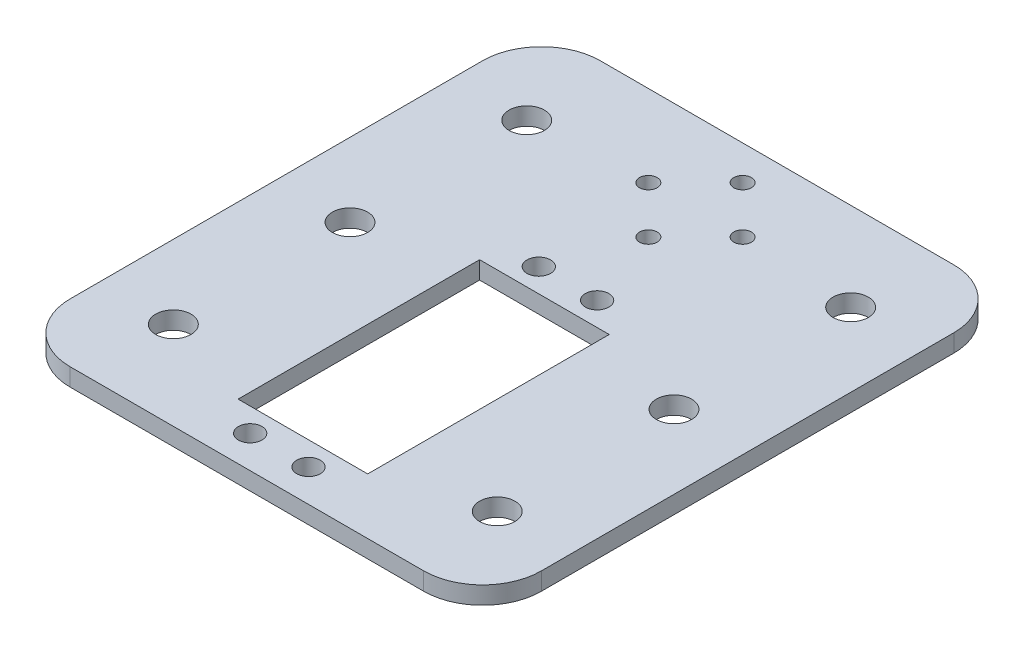
ISO-10303-21;
HEADER;
FILE_DESCRIPTION(('STEP AP214'),'2;1');
FILE_NAME('part.step','',(''),(''),'','','');
FILE_SCHEMA(('AUTOMOTIVE_DESIGN { 1 0 10303 214 1 1 1 1 }'));
ENDSEC;
DATA;
#1=APPLICATION_CONTEXT('core data for automotive mechanical design processes');
#2=APPLICATION_PROTOCOL_DEFINITION('international standard','automotive_design',2000,#1);
#3=PRODUCT_CONTEXT('',#1,'mechanical');
#4=PRODUCT('Part','Part','',(#3));
#5=PRODUCT_RELATED_PRODUCT_CATEGORY('part','',(#4));
#6=PRODUCT_DEFINITION_FORMATION('','',#4);
#7=PRODUCT_DEFINITION_CONTEXT('part definition',#1,'design');
#8=PRODUCT_DEFINITION('design','',#6,#7);
#9=PRODUCT_DEFINITION_SHAPE('','',#8);
#10=(LENGTH_UNIT() NAMED_UNIT(*) SI_UNIT(.MILLI.,.METRE.));
#11=(NAMED_UNIT(*) PLANE_ANGLE_UNIT() SI_UNIT($,.RADIAN.));
#12=(NAMED_UNIT(*) SI_UNIT($,.STERADIAN.) SOLID_ANGLE_UNIT());
#13=UNCERTAINTY_MEASURE_WITH_UNIT(LENGTH_MEASURE(1.E-05),#10,'distance_accuracy_value','');
#14=(GEOMETRIC_REPRESENTATION_CONTEXT(3) GLOBAL_UNCERTAINTY_ASSIGNED_CONTEXT((#13)) GLOBAL_UNIT_ASSIGNED_CONTEXT((#10,
#11,#12)) REPRESENTATION_CONTEXT('',''));
#15=CARTESIAN_POINT('',(0.,0.,0.));
#16=DIRECTION('',(0.,0.,1.));
#17=DIRECTION('',(1.,0.,0.));
#18=AXIS2_PLACEMENT_3D('',#15,#16,#17);
#19=CARTESIAN_POINT('',(0.,3.,0.));
#20=DIRECTION('',(0.,1.,0.));
#21=DIRECTION('',(0.,0.,1.));
#22=AXIS2_PLACEMENT_3D('',#19,#20,#21);
#23=PLANE('',#22);
#24=CARTESIAN_POINT('',(0.,3.,-54.15));
#25=DIRECTION('',(0.,1.,0.));
#26=DIRECTION('',(0.,0.,1.));
#27=AXIS2_PLACEMENT_3D('',#24,#25,#26);
#28=CIRCLE('',#27,1.5);
#29=CARTESIAN_POINT('',(0.,3.,-52.65));
#30=VERTEX_POINT('',#29);
#31=EDGE_CURVE('E615',#30,#30,#28,.T.);
#32=ORIENTED_EDGE('',*,*,#31,.F.);
#33=EDGE_LOOP('',(#32));
#34=FACE_BOUND('',#33,.T.);
#35=CARTESIAN_POINT('',(7.99999999999997,3.,-46.15));
#36=DIRECTION('',(0.,1.,0.));
#37=DIRECTION('',(0.,0.,1.));
#38=AXIS2_PLACEMENT_3D('',#35,#36,#37);
#39=CIRCLE('',#38,1.49999999999995);
#40=CARTESIAN_POINT('',(7.99999999999997,3.,-44.65));
#41=VERTEX_POINT('',#40);
#42=EDGE_CURVE('E642',#41,#41,#39,.T.);
#43=ORIENTED_EDGE('',*,*,#42,.F.);
#44=EDGE_LOOP('',(#43));
#45=FACE_BOUND('',#44,.T.);
#46=CARTESIAN_POINT('',(0.,3.,-38.15));
#47=DIRECTION('',(0.,1.,0.));
#48=DIRECTION('',(0.,0.,1.));
#49=AXIS2_PLACEMENT_3D('',#46,#47,#48);
#50=CIRCLE('',#49,1.49999999999984);
#51=CARTESIAN_POINT('',(0.,3.,-36.6500000000002));
#52=VERTEX_POINT('',#51);
#53=EDGE_CURVE('E636',#52,#52,#50,.T.);
#54=ORIENTED_EDGE('',*,*,#53,.F.);
#55=EDGE_LOOP('',(#54));
#56=FACE_BOUND('',#55,.T.);
#57=CARTESIAN_POINT('',(-8.00000000000004,3.,-46.15));
#58=DIRECTION('',(0.,1.,0.));
#59=DIRECTION('',(0.,0.,1.));
#60=AXIS2_PLACEMENT_3D('',#57,#58,#59);
#61=CIRCLE('',#60,1.49999999999995);
#62=CARTESIAN_POINT('',(-8.00000000000004,3.,-44.6500000000001));
#63=VERTEX_POINT('',#62);
#64=EDGE_CURVE('E630',#63,#63,#61,.T.);
#65=ORIENTED_EDGE('',*,*,#64,.F.);
#66=EDGE_LOOP('',(#65));
#67=FACE_BOUND('',#66,.T.);
#68=CARTESIAN_POINT('',(27.4999999999999,3.,-45.));
#69=DIRECTION('',(0.,1.,0.));
#70=DIRECTION('',(0.,0.,1.));
#71=AXIS2_PLACEMENT_3D('',#68,#69,#70);
#72=CIRCLE('',#71,3.);
#73=CARTESIAN_POINT('',(27.4999999999999,3.,-42.));
#74=VERTEX_POINT('',#73);
#75=EDGE_CURVE('E161',#74,#74,#72,.T.);
#76=ORIENTED_EDGE('',*,*,#75,.F.);
#77=EDGE_LOOP('',(#76));
#78=FACE_BOUND('',#77,.T.);
#79=CARTESIAN_POINT('',(4.95,3.,24.5));
#80=DIRECTION('',(0.,1.,0.));
#81=DIRECTION('',(0.,0.,-1.));
#82=AXIS2_PLACEMENT_3D('',#79,#80,#81);
#83=CIRCLE('',#82,2.);
#84=CARTESIAN_POINT('',(4.95,3.,22.5));
#85=VERTEX_POINT('',#84);
#86=EDGE_CURVE('E178',#85,#85,#83,.T.);
#87=ORIENTED_EDGE('',*,*,#86,.F.);
#88=EDGE_LOOP('',(#87));
#89=FACE_BOUND('',#88,.T.);
#90=CARTESIAN_POINT('',(4.95,3.,-24.5));
#91=DIRECTION('',(0.,1.,0.));
#92=DIRECTION('',(0.,0.,1.));
#93=AXIS2_PLACEMENT_3D('',#90,#91,#92);
#94=CIRCLE('',#93,2.);
#95=CARTESIAN_POINT('',(4.95,3.,-22.5));
#96=VERTEX_POINT('',#95);
#97=EDGE_CURVE('E190',#96,#96,#94,.T.);
#98=ORIENTED_EDGE('',*,*,#97,.F.);
#99=EDGE_LOOP('',(#98));
#100=FACE_BOUND('',#99,.T.);
#101=CARTESIAN_POINT('',(-27.5,3.,15.));
#102=DIRECTION('',(0.,1.,0.));
#103=DIRECTION('',(0.,0.,-1.));
#104=AXIS2_PLACEMENT_3D('',#101,#102,#103);
#105=CIRCLE('',#104,3.);
#106=CARTESIAN_POINT('',(-27.5,3.,12.));
#107=VERTEX_POINT('',#106);
#108=EDGE_CURVE('E202',#107,#107,#105,.T.);
#109=ORIENTED_EDGE('',*,*,#108,.F.);
#110=EDGE_LOOP('',(#109));
#111=FACE_BOUND('',#110,.T.);
#112=CARTESIAN_POINT('',(27.5,3.,-15.));
#113=DIRECTION('',(0.,1.,0.));
#114=DIRECTION('',(0.,0.,1.));
#115=AXIS2_PLACEMENT_3D('',#112,#113,#114);
#116=CIRCLE('',#115,3.);
#117=CARTESIAN_POINT('',(27.5,3.,-12.));
#118=VERTEX_POINT('',#117);
#119=EDGE_CURVE('E214',#118,#118,#116,.T.);
#120=ORIENTED_EDGE('',*,*,#119,.F.);
#121=EDGE_LOOP('',(#120));
#122=FACE_BOUND('',#121,.T.);
#123=DIRECTION('',(-1.,0.,0.));
#124=VECTOR('',#123,1.);
#125=CARTESIAN_POINT('',(-40.,3.,-60.));
#126=LINE('',#125,#124);
#127=CARTESIAN_POINT('',(30.,3.,-60.));
#128=VERTEX_POINT('',#127);
#129=CARTESIAN_POINT('',(-30.,3.,-60.));
#130=VERTEX_POINT('',#129);
#131=EDGE_CURVE('E220',#128,#130,#126,.T.);
#132=ORIENTED_EDGE('',*,*,#131,.T.);
#133=CARTESIAN_POINT('',(-30.,3.,-50.));
#134=DIRECTION('',(0.,1.,0.));
#135=DIRECTION('',(0.,0.,1.));
#136=AXIS2_PLACEMENT_3D('',#133,#134,#135);
#137=CIRCLE('',#136,10.);
#138=CARTESIAN_POINT('',(-40.,3.,-50.));
#139=VERTEX_POINT('',#138);
#140=EDGE_CURVE('E263',#130,#139,#137,.T.);
#141=ORIENTED_EDGE('',*,*,#140,.T.);
#142=DIRECTION('',(0.,0.,1.));
#143=VECTOR('',#142,1.);
#144=CARTESIAN_POINT('',(-40.,3.,30.));
#145=LINE('',#144,#143);
#146=CARTESIAN_POINT('',(-40.,3.,20.));
#147=VERTEX_POINT('',#146);
#148=EDGE_CURVE('E223',#139,#147,#145,.T.);
#149=ORIENTED_EDGE('',*,*,#148,.T.);
#150=CARTESIAN_POINT('',(-30.,3.,20.));
#151=DIRECTION('',(0.,1.,0.));
#152=DIRECTION('',(0.,0.,1.));
#153=AXIS2_PLACEMENT_3D('',#150,#151,#152);
#154=CIRCLE('',#153,10.);
#155=CARTESIAN_POINT('',(-30.,3.,30.));
#156=VERTEX_POINT('',#155);
#157=EDGE_CURVE('E258',#147,#156,#154,.T.);
#158=ORIENTED_EDGE('',*,*,#157,.T.);
#159=DIRECTION('',(1.,0.,0.));
#160=VECTOR('',#159,1.);
#161=CARTESIAN_POINT('',(-40.,3.,30.));
#162=LINE('',#161,#160);
#163=CARTESIAN_POINT('',(30.,3.,30.));
#164=VERTEX_POINT('',#163);
#165=EDGE_CURVE('E227',#156,#164,#162,.T.);
#166=ORIENTED_EDGE('',*,*,#165,.T.);
#167=CARTESIAN_POINT('',(30.,3.,20.));
#168=DIRECTION('',(0.,1.,0.));
#169=DIRECTION('',(0.,0.,1.));
#170=AXIS2_PLACEMENT_3D('',#167,#168,#169);
#171=CIRCLE('',#170,10.);
#172=CARTESIAN_POINT('',(40.,3.,20.));
#173=VERTEX_POINT('',#172);
#174=EDGE_CURVE('E59',#164,#173,#171,.T.);
#175=ORIENTED_EDGE('',*,*,#174,.T.);
#176=DIRECTION('',(0.,0.,-1.));
#177=VECTOR('',#176,1.);
#178=CARTESIAN_POINT('',(40.,3.,30.));
#179=LINE('',#178,#177);
#180=CARTESIAN_POINT('',(40.,3.,-50.));
#181=VERTEX_POINT('',#180);
#182=EDGE_CURVE('E229',#173,#181,#179,.T.);
#183=ORIENTED_EDGE('',*,*,#182,.T.);
#184=CARTESIAN_POINT('',(30.,3.,-50.));
#185=DIRECTION('',(0.,1.,0.));
#186=DIRECTION('',(0.,0.,1.));
#187=AXIS2_PLACEMENT_3D('',#184,#185,#186);
#188=CIRCLE('',#187,10.);
#189=EDGE_CURVE('E261',#181,#128,#188,.T.);
#190=ORIENTED_EDGE('',*,*,#189,.T.);
#191=EDGE_LOOP('',(#132,#141,#149,#158,#166,#175,#183,#190));
#192=FACE_BOUND('',#191,.T.);
#193=CARTESIAN_POINT('',(27.5,3.,15.));
#194=DIRECTION('',(0.,1.,0.));
#195=DIRECTION('',(0.,0.,1.));
#196=AXIS2_PLACEMENT_3D('',#193,#194,#195);
#197=CIRCLE('',#196,3.);
#198=CARTESIAN_POINT('',(27.5,3.,18.));
#199=VERTEX_POINT('',#198);
#200=EDGE_CURVE('E208',#199,#199,#197,.T.);
#201=ORIENTED_EDGE('',*,*,#200,.F.);
#202=EDGE_LOOP('',(#201));
#203=FACE_BOUND('',#202,.T.);
#204=CARTESIAN_POINT('',(-27.5,3.,-15.));
#205=DIRECTION('',(0.,1.,0.));
#206=DIRECTION('',(0.,0.,-1.));
#207=AXIS2_PLACEMENT_3D('',#204,#205,#206);
#208=CIRCLE('',#207,3.);
#209=CARTESIAN_POINT('',(-27.5,3.,-18.));
#210=VERTEX_POINT('',#209);
#211=EDGE_CURVE('E196',#210,#210,#208,.T.);
#212=ORIENTED_EDGE('',*,*,#211,.F.);
#213=EDGE_LOOP('',(#212));
#214=FACE_BOUND('',#213,.T.);
#215=CARTESIAN_POINT('',(-4.95,3.,-24.5));
#216=DIRECTION('',(0.,1.,0.));
#217=DIRECTION('',(0.,0.,-1.));
#218=AXIS2_PLACEMENT_3D('',#215,#216,#217);
#219=CIRCLE('',#218,2.);
#220=CARTESIAN_POINT('',(-4.95,3.,-26.5));
#221=VERTEX_POINT('',#220);
#222=EDGE_CURVE('E184',#221,#221,#219,.T.);
#223=ORIENTED_EDGE('',*,*,#222,.F.);
#224=EDGE_LOOP('',(#223));
#225=FACE_BOUND('',#224,.T.);
#226=CARTESIAN_POINT('',(-4.95,3.,24.5));
#227=DIRECTION('',(0.,1.,0.));
#228=DIRECTION('',(0.,0.,1.));
#229=AXIS2_PLACEMENT_3D('',#226,#227,#228);
#230=CIRCLE('',#229,2.);
#231=CARTESIAN_POINT('',(-4.95,3.,26.5));
#232=VERTEX_POINT('',#231);
#233=EDGE_CURVE('E172',#232,#232,#230,.T.);
#234=ORIENTED_EDGE('',*,*,#233,.F.);
#235=EDGE_LOOP('',(#234));
#236=FACE_BOUND('',#235,.T.);
#237=DIRECTION('',(-1.,0.,0.));
#238=VECTOR('',#237,1.);
#239=CARTESIAN_POINT('',(-11.,3.,-20.5));
#240=LINE('',#239,#238);
#241=CARTESIAN_POINT('',(11.,3.,-20.5));
#242=VERTEX_POINT('',#241);
#243=CARTESIAN_POINT('',(-11.,3.,-20.5));
#244=VERTEX_POINT('',#243);
#245=EDGE_CURVE('E138',#242,#244,#240,.T.);
#246=ORIENTED_EDGE('',*,*,#245,.F.);
#247=DIRECTION('',(0.,0.,-1.));
#248=VECTOR('',#247,1.);
#249=CARTESIAN_POINT('',(11.,3.,20.5));
#250=LINE('',#249,#248);
#251=CARTESIAN_POINT('',(11.,3.,20.5));
#252=VERTEX_POINT('',#251);
#253=EDGE_CURVE('E128',#252,#242,#250,.T.);
#254=ORIENTED_EDGE('',*,*,#253,.F.);
#255=DIRECTION('',(1.,0.,0.));
#256=VECTOR('',#255,1.);
#257=CARTESIAN_POINT('',(-11.,3.,20.5));
#258=LINE('',#257,#256);
#259=CARTESIAN_POINT('',(-11.,3.,20.5));
#260=VERTEX_POINT('',#259);
#261=EDGE_CURVE('E154',#260,#252,#258,.T.);
#262=ORIENTED_EDGE('',*,*,#261,.F.);
#263=DIRECTION('',(0.,0.,1.));
#264=VECTOR('',#263,1.);
#265=CARTESIAN_POINT('',(-11.,3.,20.5));
#266=LINE('',#265,#264);
#267=EDGE_CURVE('E152',#244,#260,#266,.T.);
#268=ORIENTED_EDGE('',*,*,#267,.F.);
#269=EDGE_LOOP('',(#246,#254,#262,#268));
#270=FACE_BOUND('',#269,.T.);
#271=CARTESIAN_POINT('',(-27.5000000000001,3.,-45.));
#272=DIRECTION('',(0.,1.,0.));
#273=DIRECTION('',(0.,0.,-1.));
#274=AXIS2_PLACEMENT_3D('',#271,#272,#273);
#275=CIRCLE('',#274,3.);
#276=CARTESIAN_POINT('',(-27.5000000000001,3.,-48.));
#277=VERTEX_POINT('',#276);
#278=EDGE_CURVE('E614',#277,#277,#275,.T.);
#279=ORIENTED_EDGE('',*,*,#278,.F.);
#280=EDGE_LOOP('',(#279));
#281=FACE_BOUND('',#280,.T.);
#282=ADVANCED_FACE('F37',(#34,#45,#56,#67,#78,#89,#100,#111,#122,#192,#203,#214,#225,#236,#270,
#281),#23,.T.);
#283=CARTESIAN_POINT('',(0.,0.,0.));
#284=DIRECTION('',(0.,1.,0.));
#285=DIRECTION('',(0.,0.,1.));
#286=AXIS2_PLACEMENT_3D('',#283,#284,#285);
#287=PLANE('',#286);
#288=CARTESIAN_POINT('',(0.,0.,-54.15));
#289=DIRECTION('',(0.,1.,0.));
#290=DIRECTION('',(0.,0.,1.));
#291=AXIS2_PLACEMENT_3D('',#288,#289,#290);
#292=CIRCLE('',#291,1.5);
#293=CARTESIAN_POINT('',(0.,0.,-52.65));
#294=VERTEX_POINT('',#293);
#295=EDGE_CURVE('E619',#294,#294,#292,.T.);
#296=ORIENTED_EDGE('',*,*,#295,.T.);
#297=EDGE_LOOP('',(#296));
#298=FACE_BOUND('',#297,.T.);
#299=CARTESIAN_POINT('',(7.99999999999997,0.,-46.15));
#300=DIRECTION('',(0.,1.,0.));
#301=DIRECTION('',(0.,0.,1.));
#302=AXIS2_PLACEMENT_3D('',#299,#300,#301);
#303=CIRCLE('',#302,1.49999999999995);
#304=CARTESIAN_POINT('',(7.99999999999997,0.,-44.65));
#305=VERTEX_POINT('',#304);
#306=EDGE_CURVE('E639',#305,#305,#303,.T.);
#307=ORIENTED_EDGE('',*,*,#306,.T.);
#308=EDGE_LOOP('',(#307));
#309=FACE_BOUND('',#308,.T.);
#310=CARTESIAN_POINT('',(0.,0.,-38.15));
#311=DIRECTION('',(0.,1.,0.));
#312=DIRECTION('',(0.,0.,1.));
#313=AXIS2_PLACEMENT_3D('',#310,#311,#312);
#314=CIRCLE('',#313,1.49999999999984);
#315=CARTESIAN_POINT('',(0.,0.,-36.6500000000002));
#316=VERTEX_POINT('',#315);
#317=EDGE_CURVE('E633',#316,#316,#314,.T.);
#318=ORIENTED_EDGE('',*,*,#317,.T.);
#319=EDGE_LOOP('',(#318));
#320=FACE_BOUND('',#319,.T.);
#321=CARTESIAN_POINT('',(-8.00000000000004,0.,-46.15));
#322=DIRECTION('',(0.,1.,0.));
#323=DIRECTION('',(0.,0.,1.));
#324=AXIS2_PLACEMENT_3D('',#321,#322,#323);
#325=CIRCLE('',#324,1.49999999999995);
#326=CARTESIAN_POINT('',(-8.00000000000004,0.,-44.6500000000001));
#327=VERTEX_POINT('',#326);
#328=EDGE_CURVE('E627',#327,#327,#325,.T.);
#329=ORIENTED_EDGE('',*,*,#328,.T.);
#330=EDGE_LOOP('',(#329));
#331=FACE_BOUND('',#330,.T.);
#332=CARTESIAN_POINT('',(-4.95,0.,24.5));
#333=DIRECTION('',(0.,1.,0.));
#334=DIRECTION('',(0.,0.,1.));
#335=AXIS2_PLACEMENT_3D('',#332,#333,#334);
#336=CIRCLE('',#335,2.);
#337=CARTESIAN_POINT('',(-4.95,0.,26.5));
#338=VERTEX_POINT('',#337);
#339=EDGE_CURVE('E146',#338,#338,#336,.T.);
#340=ORIENTED_EDGE('',*,*,#339,.T.);
#341=EDGE_LOOP('',(#340));
#342=FACE_BOUND('',#341,.T.);
#343=CARTESIAN_POINT('',(4.95,0.,24.5));
#344=DIRECTION('',(0.,1.,0.));
#345=DIRECTION('',(0.,0.,-1.));
#346=AXIS2_PLACEMENT_3D('',#343,#344,#345);
#347=CIRCLE('',#346,2.);
#348=CARTESIAN_POINT('',(4.95,0.,22.5));
#349=VERTEX_POINT('',#348);
#350=EDGE_CURVE('E175',#349,#349,#347,.T.);
#351=ORIENTED_EDGE('',*,*,#350,.T.);
#352=EDGE_LOOP('',(#351));
#353=FACE_BOUND('',#352,.T.);
#354=CARTESIAN_POINT('',(-4.95,0.,-24.5));
#355=DIRECTION('',(0.,1.,0.));
#356=DIRECTION('',(0.,0.,-1.));
#357=AXIS2_PLACEMENT_3D('',#354,#355,#356);
#358=CIRCLE('',#357,2.);
#359=CARTESIAN_POINT('',(-4.95,0.,-26.5));
#360=VERTEX_POINT('',#359);
#361=EDGE_CURVE('E181',#360,#360,#358,.T.);
#362=ORIENTED_EDGE('',*,*,#361,.T.);
#363=EDGE_LOOP('',(#362));
#364=FACE_BOUND('',#363,.T.);
#365=CARTESIAN_POINT('',(4.95,0.,-24.5));
#366=DIRECTION('',(0.,1.,0.));
#367=DIRECTION('',(0.,0.,1.));
#368=AXIS2_PLACEMENT_3D('',#365,#366,#367);
#369=CIRCLE('',#368,2.);
#370=CARTESIAN_POINT('',(4.95,0.,-22.5));
#371=VERTEX_POINT('',#370);
#372=EDGE_CURVE('E187',#371,#371,#369,.T.);
#373=ORIENTED_EDGE('',*,*,#372,.T.);
#374=EDGE_LOOP('',(#373));
#375=FACE_BOUND('',#374,.T.);
#376=CARTESIAN_POINT('',(-27.5,0.,-15.));
#377=DIRECTION('',(0.,1.,0.));
#378=DIRECTION('',(0.,0.,-1.));
#379=AXIS2_PLACEMENT_3D('',#376,#377,#378);
#380=CIRCLE('',#379,3.);
#381=CARTESIAN_POINT('',(-27.5,0.,-18.));
#382=VERTEX_POINT('',#381);
#383=EDGE_CURVE('E193',#382,#382,#380,.T.);
#384=ORIENTED_EDGE('',*,*,#383,.T.);
#385=EDGE_LOOP('',(#384));
#386=FACE_BOUND('',#385,.T.);
#387=CARTESIAN_POINT('',(-27.5,0.,15.));
#388=DIRECTION('',(0.,1.,0.));
#389=DIRECTION('',(0.,0.,-1.));
#390=AXIS2_PLACEMENT_3D('',#387,#388,#389);
#391=CIRCLE('',#390,3.);
#392=CARTESIAN_POINT('',(-27.5,0.,12.));
#393=VERTEX_POINT('',#392);
#394=EDGE_CURVE('E199',#393,#393,#391,.T.);
#395=ORIENTED_EDGE('',*,*,#394,.T.);
#396=EDGE_LOOP('',(#395));
#397=FACE_BOUND('',#396,.T.);
#398=CARTESIAN_POINT('',(27.5,0.,15.));
#399=DIRECTION('',(0.,1.,0.));
#400=DIRECTION('',(0.,0.,1.));
#401=AXIS2_PLACEMENT_3D('',#398,#399,#400);
#402=CIRCLE('',#401,3.);
#403=CARTESIAN_POINT('',(27.5,0.,18.));
#404=VERTEX_POINT('',#403);
#405=EDGE_CURVE('E205',#404,#404,#402,.T.);
#406=ORIENTED_EDGE('',*,*,#405,.T.);
#407=EDGE_LOOP('',(#406));
#408=FACE_BOUND('',#407,.T.);
#409=CARTESIAN_POINT('',(27.5,0.,-15.));
#410=DIRECTION('',(0.,1.,0.));
#411=DIRECTION('',(0.,0.,1.));
#412=AXIS2_PLACEMENT_3D('',#409,#410,#411);
#413=CIRCLE('',#412,3.);
#414=CARTESIAN_POINT('',(27.5,0.,-12.));
#415=VERTEX_POINT('',#414);
#416=EDGE_CURVE('E211',#415,#415,#413,.T.);
#417=ORIENTED_EDGE('',*,*,#416,.T.);
#418=EDGE_LOOP('',(#417));
#419=FACE_BOUND('',#418,.T.);
#420=DIRECTION('',(0.,0.,1.));
#421=VECTOR('',#420,1.);
#422=CARTESIAN_POINT('',(-40.,0.,30.));
#423=LINE('',#422,#421);
#424=CARTESIAN_POINT('',(-40.,0.,-50.));
#425=VERTEX_POINT('',#424);
#426=CARTESIAN_POINT('',(-40.,0.,20.));
#427=VERTEX_POINT('',#426);
#428=EDGE_CURVE('E234',#425,#427,#423,.T.);
#429=ORIENTED_EDGE('',*,*,#428,.F.);
#430=CARTESIAN_POINT('',(-30.,0.,-50.));
#431=DIRECTION('',(0.,1.,0.));
#432=DIRECTION('',(0.,0.,1.));
#433=AXIS2_PLACEMENT_3D('',#430,#431,#432);
#434=CIRCLE('',#433,10.);
#435=CARTESIAN_POINT('',(-30.,0.,-60.));
#436=VERTEX_POINT('',#435);
#437=EDGE_CURVE('E251',#425,#436,#434,.F.);
#438=ORIENTED_EDGE('',*,*,#437,.T.);
#439=DIRECTION('',(-1.,0.,0.));
#440=VECTOR('',#439,1.);
#441=CARTESIAN_POINT('',(-40.,0.,-60.));
#442=LINE('',#441,#440);
#443=CARTESIAN_POINT('',(30.,0.,-60.));
#444=VERTEX_POINT('',#443);
#445=EDGE_CURVE('E217',#444,#436,#442,.T.);
#446=ORIENTED_EDGE('',*,*,#445,.F.);
#447=CARTESIAN_POINT('',(30.,0.,-50.));
#448=DIRECTION('',(0.,1.,0.));
#449=DIRECTION('',(0.,0.,1.));
#450=AXIS2_PLACEMENT_3D('',#447,#448,#449);
#451=CIRCLE('',#450,10.);
#452=CARTESIAN_POINT('',(40.,0.,-50.));
#453=VERTEX_POINT('',#452);
#454=EDGE_CURVE('E249',#444,#453,#451,.F.);
#455=ORIENTED_EDGE('',*,*,#454,.T.);
#456=DIRECTION('',(0.,0.,-1.));
#457=VECTOR('',#456,1.);
#458=CARTESIAN_POINT('',(40.,0.,30.));
#459=LINE('',#458,#457);
#460=CARTESIAN_POINT('',(40.,0.,20.));
#461=VERTEX_POINT('',#460);
#462=EDGE_CURVE('E224',#461,#453,#459,.T.);
#463=ORIENTED_EDGE('',*,*,#462,.F.);
#464=CARTESIAN_POINT('',(30.,0.,20.));
#465=DIRECTION('',(0.,1.,0.));
#466=DIRECTION('',(0.,0.,1.));
#467=AXIS2_PLACEMENT_3D('',#464,#465,#466);
#468=CIRCLE('',#467,10.);
#469=CARTESIAN_POINT('',(30.,0.,30.));
#470=VERTEX_POINT('',#469);
#471=EDGE_CURVE('E247',#461,#470,#468,.F.);
#472=ORIENTED_EDGE('',*,*,#471,.T.);
#473=DIRECTION('',(1.,0.,0.));
#474=VECTOR('',#473,1.);
#475=CARTESIAN_POINT('',(-40.,0.,30.));
#476=LINE('',#475,#474);
#477=CARTESIAN_POINT('',(-30.,0.,30.));
#478=VERTEX_POINT('',#477);
#479=EDGE_CURVE('E237',#478,#470,#476,.T.);
#480=ORIENTED_EDGE('',*,*,#479,.F.);
#481=CARTESIAN_POINT('',(-30.,0.,20.));
#482=DIRECTION('',(0.,1.,0.));
#483=DIRECTION('',(0.,0.,1.));
#484=AXIS2_PLACEMENT_3D('',#481,#482,#483);
#485=CIRCLE('',#484,10.);
#486=EDGE_CURVE('E245',#478,#427,#485,.F.);
#487=ORIENTED_EDGE('',*,*,#486,.T.);
#488=EDGE_LOOP('',(#429,#438,#446,#455,#463,#472,#480,#487));
#489=FACE_BOUND('',#488,.T.);
#490=DIRECTION('',(0.,0.,-1.));
#491=VECTOR('',#490,1.);
#492=CARTESIAN_POINT('',(11.,0.,20.5));
#493=LINE('',#492,#491);
#494=CARTESIAN_POINT('',(11.,0.,20.5));
#495=VERTEX_POINT('',#494);
#496=CARTESIAN_POINT('',(11.,0.,-20.5));
#497=VERTEX_POINT('',#496);
#498=EDGE_CURVE('E159',#495,#497,#493,.T.);
#499=ORIENTED_EDGE('',*,*,#498,.T.);
#500=DIRECTION('',(-1.,0.,0.));
#501=VECTOR('',#500,1.);
#502=CARTESIAN_POINT('',(-11.,0.,-20.5));
#503=LINE('',#502,#501);
#504=CARTESIAN_POINT('',(-11.,0.,-20.5));
#505=VERTEX_POINT('',#504);
#506=EDGE_CURVE('E145',#497,#505,#503,.T.);
#507=ORIENTED_EDGE('',*,*,#506,.T.);
#508=DIRECTION('',(0.,0.,1.));
#509=VECTOR('',#508,1.);
#510=CARTESIAN_POINT('',(-11.,0.,20.5));
#511=LINE('',#510,#509);
#512=CARTESIAN_POINT('',(-11.,0.,20.5));
#513=VERTEX_POINT('',#512);
#514=EDGE_CURVE('E163',#505,#513,#511,.T.);
#515=ORIENTED_EDGE('',*,*,#514,.T.);
#516=DIRECTION('',(1.,0.,0.));
#517=VECTOR('',#516,1.);
#518=CARTESIAN_POINT('',(-11.,0.,20.5));
#519=LINE('',#518,#517);
#520=EDGE_CURVE('E139',#513,#495,#519,.T.);
#521=ORIENTED_EDGE('',*,*,#520,.T.);
#522=EDGE_LOOP('',(#499,#507,#515,#521));
#523=FACE_BOUND('',#522,.T.);
#524=CARTESIAN_POINT('',(27.4999999999999,0.,-45.));
#525=DIRECTION('',(0.,1.,0.));
#526=DIRECTION('',(0.,0.,1.));
#527=AXIS2_PLACEMENT_3D('',#524,#525,#526);
#528=CIRCLE('',#527,3.);
#529=CARTESIAN_POINT('',(27.4999999999999,0.,-42.));
#530=VERTEX_POINT('',#529);
#531=EDGE_CURVE('E609',#530,#530,#528,.T.);
#532=ORIENTED_EDGE('',*,*,#531,.T.);
#533=EDGE_LOOP('',(#532));
#534=FACE_BOUND('',#533,.T.);
#535=CARTESIAN_POINT('',(-27.5000000000001,0.,-45.));
#536=DIRECTION('',(0.,1.,0.));
#537=DIRECTION('',(0.,0.,-1.));
#538=AXIS2_PLACEMENT_3D('',#535,#536,#537);
#539=CIRCLE('',#538,3.);
#540=CARTESIAN_POINT('',(-27.5000000000001,0.,-48.));
#541=VERTEX_POINT('',#540);
#542=EDGE_CURVE('E612',#541,#541,#539,.T.);
#543=ORIENTED_EDGE('',*,*,#542,.T.);
#544=EDGE_LOOP('',(#543));
#545=FACE_BOUND('',#544,.T.);
#546=ADVANCED_FACE('F279',(#298,#309,#320,#331,#342,#353,#364,#375,#386,#397,#408,#419,#489,
#523,#534,#545),#287,.F.);
#547=CARTESIAN_POINT('',(-40.,3.,-60.));
#548=DIRECTION('',(0.,0.,1.));
#549=DIRECTION('',(1.,0.,0.));
#550=AXIS2_PLACEMENT_3D('',#547,#548,#549);
#551=PLANE('',#550);
#552=ORIENTED_EDGE('',*,*,#445,.T.);
#553=DIRECTION('',(0.,-1.,0.));
#554=VECTOR('',#553,1.);
#555=CARTESIAN_POINT('',(-30.,3.,-60.));
#556=LINE('',#555,#554);
#557=EDGE_CURVE('E256',#436,#130,#556,.F.);
#558=ORIENTED_EDGE('',*,*,#557,.T.);
#559=ORIENTED_EDGE('',*,*,#131,.F.);
#560=DIRECTION('',(0.,-1.,0.));
#561=VECTOR('',#560,1.);
#562=CARTESIAN_POINT('',(30.,3.,-60.));
#563=LINE('',#562,#561);
#564=EDGE_CURVE('E253',#128,#444,#563,.T.);
#565=ORIENTED_EDGE('',*,*,#564,.T.);
#566=EDGE_LOOP('',(#552,#558,#559,#565));
#567=FACE_BOUND('',#566,.T.);
#568=ADVANCED_FACE('F294',(#567),#551,.F.);
#569=CARTESIAN_POINT('',(-40.,3.,30.));
#570=DIRECTION('',(1.,0.,0.));
#571=DIRECTION('',(0.,0.,-1.));
#572=AXIS2_PLACEMENT_3D('',#569,#570,#571);
#573=PLANE('',#572);
#574=ORIENTED_EDGE('',*,*,#148,.F.);
#575=DIRECTION('',(0.,-1.,0.));
#576=VECTOR('',#575,1.);
#577=CARTESIAN_POINT('',(-40.,3.,-50.));
#578=LINE('',#577,#576);
#579=EDGE_CURVE('E242',#139,#425,#578,.T.);
#580=ORIENTED_EDGE('',*,*,#579,.T.);
#581=ORIENTED_EDGE('',*,*,#428,.T.);
#582=DIRECTION('',(0.,-1.,0.));
#583=VECTOR('',#582,1.);
#584=CARTESIAN_POINT('',(-40.,3.,20.));
#585=LINE('',#584,#583);
#586=EDGE_CURVE('E231',#427,#147,#585,.F.);
#587=ORIENTED_EDGE('',*,*,#586,.T.);
#588=EDGE_LOOP('',(#574,#580,#581,#587));
#589=FACE_BOUND('',#588,.T.);
#590=ADVANCED_FACE('F302',(#589),#573,.F.);
#591=CARTESIAN_POINT('',(-40.,3.,30.));
#592=DIRECTION('',(0.,0.,-1.));
#593=DIRECTION('',(-1.,0.,0.));
#594=AXIS2_PLACEMENT_3D('',#591,#592,#593);
#595=PLANE('',#594);
#596=ORIENTED_EDGE('',*,*,#479,.T.);
#597=DIRECTION('',(0.,-1.,0.));
#598=VECTOR('',#597,1.);
#599=CARTESIAN_POINT('',(30.,3.,30.));
#600=LINE('',#599,#598);
#601=EDGE_CURVE('E11',#470,#164,#600,.F.);
#602=ORIENTED_EDGE('',*,*,#601,.T.);
#603=ORIENTED_EDGE('',*,*,#165,.F.);
#604=DIRECTION('',(0.,-1.,0.));
#605=VECTOR('',#604,1.);
#606=CARTESIAN_POINT('',(-30.,3.,30.));
#607=LINE('',#606,#605);
#608=EDGE_CURVE('E45',#156,#478,#607,.T.);
#609=ORIENTED_EDGE('',*,*,#608,.T.);
#610=EDGE_LOOP('',(#596,#602,#603,#609));
#611=FACE_BOUND('',#610,.T.);
#612=ADVANCED_FACE('F273',(#611),#595,.F.);
#613=CARTESIAN_POINT('',(40.,3.,30.));
#614=DIRECTION('',(-1.,0.,0.));
#615=DIRECTION('',(0.,0.,1.));
#616=AXIS2_PLACEMENT_3D('',#613,#614,#615);
#617=PLANE('',#616);
#618=ORIENTED_EDGE('',*,*,#462,.T.);
#619=DIRECTION('',(0.,-1.,0.));
#620=VECTOR('',#619,1.);
#621=CARTESIAN_POINT('',(40.,3.,-50.));
#622=LINE('',#621,#620);
#623=EDGE_CURVE('E52',#453,#181,#622,.F.);
#624=ORIENTED_EDGE('',*,*,#623,.T.);
#625=ORIENTED_EDGE('',*,*,#182,.F.);
#626=DIRECTION('',(0.,-1.,0.));
#627=VECTOR('',#626,1.);
#628=CARTESIAN_POINT('',(40.,3.,20.));
#629=LINE('',#628,#627);
#630=EDGE_CURVE('E265',#173,#461,#629,.T.);
#631=ORIENTED_EDGE('',*,*,#630,.T.);
#632=EDGE_LOOP('',(#618,#624,#625,#631));
#633=FACE_BOUND('',#632,.T.);
#634=ADVANCED_FACE('F285',(#633),#617,.F.);
#635=CARTESIAN_POINT('',(27.5,3.,-15.));
#636=DIRECTION('',(0.,-1.,0.));
#637=DIRECTION('',(0.,0.,-1.));
#638=AXIS2_PLACEMENT_3D('',#635,#636,#637);
#639=CYLINDRICAL_SURFACE('',#638,3.);
#640=ORIENTED_EDGE('',*,*,#119,.T.);
#641=EDGE_LOOP('',(#640));
#642=FACE_BOUND('',#641,.T.);
#643=ORIENTED_EDGE('',*,*,#416,.F.);
#644=EDGE_LOOP('',(#643));
#645=FACE_BOUND('',#644,.T.);
#646=ADVANCED_FACE('F324',(#642,#645),#639,.F.);
#647=CARTESIAN_POINT('',(27.5,3.,15.));
#648=DIRECTION('',(0.,-1.,0.));
#649=DIRECTION('',(0.,0.,-1.));
#650=AXIS2_PLACEMENT_3D('',#647,#648,#649);
#651=CYLINDRICAL_SURFACE('',#650,3.);
#652=ORIENTED_EDGE('',*,*,#200,.T.);
#653=EDGE_LOOP('',(#652));
#654=FACE_BOUND('',#653,.T.);
#655=ORIENTED_EDGE('',*,*,#405,.F.);
#656=EDGE_LOOP('',(#655));
#657=FACE_BOUND('',#656,.T.);
#658=ADVANCED_FACE('F445',(#654,#657),#651,.F.);
#659=CARTESIAN_POINT('',(-27.5,3.,15.));
#660=DIRECTION('',(0.,-1.,0.));
#661=DIRECTION('',(0.,0.,-1.));
#662=AXIS2_PLACEMENT_3D('',#659,#660,#661);
#663=CYLINDRICAL_SURFACE('',#662,3.);
#664=ORIENTED_EDGE('',*,*,#108,.T.);
#665=EDGE_LOOP('',(#664));
#666=FACE_BOUND('',#665,.T.);
#667=ORIENTED_EDGE('',*,*,#394,.F.);
#668=EDGE_LOOP('',(#667));
#669=FACE_BOUND('',#668,.T.);
#670=ADVANCED_FACE('F442',(#666,#669),#663,.F.);
#671=CARTESIAN_POINT('',(-27.5,3.,-15.));
#672=DIRECTION('',(0.,-1.,0.));
#673=DIRECTION('',(0.,0.,-1.));
#674=AXIS2_PLACEMENT_3D('',#671,#672,#673);
#675=CYLINDRICAL_SURFACE('',#674,3.);
#676=ORIENTED_EDGE('',*,*,#211,.T.);
#677=EDGE_LOOP('',(#676));
#678=FACE_BOUND('',#677,.T.);
#679=ORIENTED_EDGE('',*,*,#383,.F.);
#680=EDGE_LOOP('',(#679));
#681=FACE_BOUND('',#680,.T.);
#682=ADVANCED_FACE('F438',(#678,#681),#675,.F.);
#683=CARTESIAN_POINT('',(4.95,3.,-24.5));
#684=DIRECTION('',(0.,-1.,0.));
#685=DIRECTION('',(0.,0.,-1.));
#686=AXIS2_PLACEMENT_3D('',#683,#684,#685);
#687=CYLINDRICAL_SURFACE('',#686,2.);
#688=ORIENTED_EDGE('',*,*,#97,.T.);
#689=EDGE_LOOP('',(#688));
#690=FACE_BOUND('',#689,.T.);
#691=ORIENTED_EDGE('',*,*,#372,.F.);
#692=EDGE_LOOP('',(#691));
#693=FACE_BOUND('',#692,.T.);
#694=ADVANCED_FACE('F434',(#690,#693),#687,.F.);
#695=CARTESIAN_POINT('',(-4.95,3.,-24.5));
#696=DIRECTION('',(0.,-1.,0.));
#697=DIRECTION('',(0.,0.,-1.));
#698=AXIS2_PLACEMENT_3D('',#695,#696,#697);
#699=CYLINDRICAL_SURFACE('',#698,2.);
#700=ORIENTED_EDGE('',*,*,#222,.T.);
#701=EDGE_LOOP('',(#700));
#702=FACE_BOUND('',#701,.T.);
#703=ORIENTED_EDGE('',*,*,#361,.F.);
#704=EDGE_LOOP('',(#703));
#705=FACE_BOUND('',#704,.T.);
#706=ADVANCED_FACE('F430',(#702,#705),#699,.F.);
#707=CARTESIAN_POINT('',(4.95,3.,24.5));
#708=DIRECTION('',(0.,-1.,0.));
#709=DIRECTION('',(0.,0.,-1.));
#710=AXIS2_PLACEMENT_3D('',#707,#708,#709);
#711=CYLINDRICAL_SURFACE('',#710,2.);
#712=ORIENTED_EDGE('',*,*,#86,.T.);
#713=EDGE_LOOP('',(#712));
#714=FACE_BOUND('',#713,.T.);
#715=ORIENTED_EDGE('',*,*,#350,.F.);
#716=EDGE_LOOP('',(#715));
#717=FACE_BOUND('',#716,.T.);
#718=ADVANCED_FACE('F426',(#714,#717),#711,.F.);
#719=CARTESIAN_POINT('',(-4.95,3.,24.5));
#720=DIRECTION('',(0.,-1.,0.));
#721=DIRECTION('',(0.,0.,-1.));
#722=AXIS2_PLACEMENT_3D('',#719,#720,#721);
#723=CYLINDRICAL_SURFACE('',#722,2.);
#724=ORIENTED_EDGE('',*,*,#233,.T.);
#725=EDGE_LOOP('',(#724));
#726=FACE_BOUND('',#725,.T.);
#727=ORIENTED_EDGE('',*,*,#339,.F.);
#728=EDGE_LOOP('',(#727));
#729=FACE_BOUND('',#728,.T.);
#730=ADVANCED_FACE('F423',(#726,#729),#723,.F.);
#731=CARTESIAN_POINT('',(11.,3.,20.5));
#732=DIRECTION('',(-1.,0.,0.));
#733=DIRECTION('',(0.,0.,1.));
#734=AXIS2_PLACEMENT_3D('',#731,#732,#733);
#735=PLANE('',#734);
#736=ORIENTED_EDGE('',*,*,#498,.F.);
#737=DIRECTION('',(0.,-1.,0.));
#738=VECTOR('',#737,1.);
#739=CARTESIAN_POINT('',(11.,3.,20.5));
#740=LINE('',#739,#738);
#741=EDGE_CURVE('E134',#252,#495,#740,.T.);
#742=ORIENTED_EDGE('',*,*,#741,.F.);
#743=ORIENTED_EDGE('',*,*,#253,.T.);
#744=DIRECTION('',(0.,-1.,0.));
#745=VECTOR('',#744,1.);
#746=CARTESIAN_POINT('',(11.,3.,-20.5));
#747=LINE('',#746,#745);
#748=EDGE_CURVE('E131',#242,#497,#747,.T.);
#749=ORIENTED_EDGE('',*,*,#748,.T.);
#750=EDGE_LOOP('',(#736,#742,#743,#749));
#751=FACE_BOUND('',#750,.T.);
#752=ADVANCED_FACE('F130',(#751),#735,.T.);
#753=CARTESIAN_POINT('',(-11.,3.,-20.5));
#754=DIRECTION('',(0.,0.,1.));
#755=DIRECTION('',(1.,0.,0.));
#756=AXIS2_PLACEMENT_3D('',#753,#754,#755);
#757=PLANE('',#756);
#758=ORIENTED_EDGE('',*,*,#506,.F.);
#759=ORIENTED_EDGE('',*,*,#748,.F.);
#760=ORIENTED_EDGE('',*,*,#245,.T.);
#761=DIRECTION('',(0.,-1.,0.));
#762=VECTOR('',#761,1.);
#763=CARTESIAN_POINT('',(-11.,3.,-20.5));
#764=LINE('',#763,#762);
#765=EDGE_CURVE('E147',#244,#505,#764,.T.);
#766=ORIENTED_EDGE('',*,*,#765,.T.);
#767=EDGE_LOOP('',(#758,#759,#760,#766));
#768=FACE_BOUND('',#767,.T.);
#769=ADVANCED_FACE('F142',(#768),#757,.T.);
#770=CARTESIAN_POINT('',(-11.,3.,20.5));
#771=DIRECTION('',(1.,0.,0.));
#772=DIRECTION('',(0.,0.,-1.));
#773=AXIS2_PLACEMENT_3D('',#770,#771,#772);
#774=PLANE('',#773);
#775=ORIENTED_EDGE('',*,*,#514,.F.);
#776=ORIENTED_EDGE('',*,*,#765,.F.);
#777=ORIENTED_EDGE('',*,*,#267,.T.);
#778=DIRECTION('',(0.,-1.,0.));
#779=VECTOR('',#778,1.);
#780=CARTESIAN_POINT('',(-11.,3.,20.5));
#781=LINE('',#780,#779);
#782=EDGE_CURVE('E169',#260,#513,#781,.T.);
#783=ORIENTED_EDGE('',*,*,#782,.T.);
#784=EDGE_LOOP('',(#775,#776,#777,#783));
#785=FACE_BOUND('',#784,.T.);
#786=ADVANCED_FACE('F414',(#785),#774,.T.);
#787=CARTESIAN_POINT('',(-11.,3.,20.5));
#788=DIRECTION('',(0.,0.,-1.));
#789=DIRECTION('',(-1.,0.,0.));
#790=AXIS2_PLACEMENT_3D('',#787,#788,#789);
#791=PLANE('',#790);
#792=ORIENTED_EDGE('',*,*,#520,.F.);
#793=ORIENTED_EDGE('',*,*,#782,.F.);
#794=ORIENTED_EDGE('',*,*,#261,.T.);
#795=ORIENTED_EDGE('',*,*,#741,.T.);
#796=EDGE_LOOP('',(#792,#793,#794,#795));
#797=FACE_BOUND('',#796,.T.);
#798=ADVANCED_FACE('F410',(#797),#791,.T.);
#799=CARTESIAN_POINT('',(27.4999999999999,3.,-45.));
#800=DIRECTION('',(0.,-1.,0.));
#801=DIRECTION('',(0.,0.,-1.));
#802=AXIS2_PLACEMENT_3D('',#799,#800,#801);
#803=CYLINDRICAL_SURFACE('',#802,3.);
#804=ORIENTED_EDGE('',*,*,#75,.T.);
#805=EDGE_LOOP('',(#804));
#806=FACE_BOUND('',#805,.T.);
#807=ORIENTED_EDGE('',*,*,#531,.F.);
#808=EDGE_LOOP('',(#807));
#809=FACE_BOUND('',#808,.T.);
#810=ADVANCED_FACE('F406',(#806,#809),#803,.F.);
#811=CARTESIAN_POINT('',(-27.5000000000001,3.,-45.));
#812=DIRECTION('',(0.,-1.,0.));
#813=DIRECTION('',(0.,0.,-1.));
#814=AXIS2_PLACEMENT_3D('',#811,#812,#813);
#815=CYLINDRICAL_SURFACE('',#814,3.);
#816=ORIENTED_EDGE('',*,*,#278,.T.);
#817=EDGE_LOOP('',(#816));
#818=FACE_BOUND('',#817,.T.);
#819=ORIENTED_EDGE('',*,*,#542,.F.);
#820=EDGE_LOOP('',(#819));
#821=FACE_BOUND('',#820,.T.);
#822=ADVANCED_FACE('F337',(#818,#821),#815,.F.);
#823=CARTESIAN_POINT('',(-30.,3.,-50.));
#824=DIRECTION('',(0.,-1.,0.));
#825=DIRECTION('',(0.,0.,-1.));
#826=AXIS2_PLACEMENT_3D('',#823,#824,#825);
#827=CYLINDRICAL_SURFACE('',#826,10.);
#828=ORIENTED_EDGE('',*,*,#140,.F.);
#829=ORIENTED_EDGE('',*,*,#557,.F.);
#830=ORIENTED_EDGE('',*,*,#437,.F.);
#831=ORIENTED_EDGE('',*,*,#579,.F.);
#832=EDGE_LOOP('',(#828,#829,#830,#831));
#833=FACE_BOUND('',#832,.T.);
#834=ADVANCED_FACE('F299',(#833),#827,.T.);
#835=CARTESIAN_POINT('',(30.,3.,-50.));
#836=DIRECTION('',(0.,-1.,0.));
#837=DIRECTION('',(0.,0.,-1.));
#838=AXIS2_PLACEMENT_3D('',#835,#836,#837);
#839=CYLINDRICAL_SURFACE('',#838,10.);
#840=ORIENTED_EDGE('',*,*,#189,.F.);
#841=ORIENTED_EDGE('',*,*,#623,.F.);
#842=ORIENTED_EDGE('',*,*,#454,.F.);
#843=ORIENTED_EDGE('',*,*,#564,.F.);
#844=EDGE_LOOP('',(#840,#841,#842,#843));
#845=FACE_BOUND('',#844,.T.);
#846=ADVANCED_FACE('F291',(#845),#839,.T.);
#847=CARTESIAN_POINT('',(30.,3.,20.));
#848=DIRECTION('',(0.,-1.,0.));
#849=DIRECTION('',(0.,0.,-1.));
#850=AXIS2_PLACEMENT_3D('',#847,#848,#849);
#851=CYLINDRICAL_SURFACE('',#850,10.);
#852=ORIENTED_EDGE('',*,*,#174,.F.);
#853=ORIENTED_EDGE('',*,*,#601,.F.);
#854=ORIENTED_EDGE('',*,*,#471,.F.);
#855=ORIENTED_EDGE('',*,*,#630,.F.);
#856=EDGE_LOOP('',(#852,#853,#854,#855));
#857=FACE_BOUND('',#856,.T.);
#858=ADVANCED_FACE('F284',(#857),#851,.T.);
#859=CARTESIAN_POINT('',(-30.,3.,20.));
#860=DIRECTION('',(0.,-1.,0.));
#861=DIRECTION('',(0.,0.,-1.));
#862=AXIS2_PLACEMENT_3D('',#859,#860,#861);
#863=CYLINDRICAL_SURFACE('',#862,10.);
#864=ORIENTED_EDGE('',*,*,#157,.F.);
#865=ORIENTED_EDGE('',*,*,#586,.F.);
#866=ORIENTED_EDGE('',*,*,#486,.F.);
#867=ORIENTED_EDGE('',*,*,#608,.F.);
#868=EDGE_LOOP('',(#864,#865,#866,#867));
#869=FACE_BOUND('',#868,.T.);
#870=ADVANCED_FACE('F39',(#869),#863,.T.);
#871=CARTESIAN_POINT('',(-8.00000000000004,3.,-46.15));
#872=DIRECTION('',(0.,-1.,0.));
#873=DIRECTION('',(0.,0.,-1.));
#874=AXIS2_PLACEMENT_3D('',#871,#872,#873);
#875=CYLINDRICAL_SURFACE('',#874,1.49999999999995);
#876=ORIENTED_EDGE('',*,*,#64,.T.);
#877=EDGE_LOOP('',(#876));
#878=FACE_BOUND('',#877,.T.);
#879=ORIENTED_EDGE('',*,*,#328,.F.);
#880=EDGE_LOOP('',(#879));
#881=FACE_BOUND('',#880,.T.);
#882=ADVANCED_FACE('F305',(#878,#881),#875,.F.);
#883=CARTESIAN_POINT('',(0.,3.,-38.15));
#884=DIRECTION('',(0.,-1.,0.));
#885=DIRECTION('',(0.,0.,-1.));
#886=AXIS2_PLACEMENT_3D('',#883,#884,#885);
#887=CYLINDRICAL_SURFACE('',#886,1.49999999999984);
#888=ORIENTED_EDGE('',*,*,#53,.T.);
#889=EDGE_LOOP('',(#888));
#890=FACE_BOUND('',#889,.T.);
#891=ORIENTED_EDGE('',*,*,#317,.F.);
#892=EDGE_LOOP('',(#891));
#893=FACE_BOUND('',#892,.T.);
#894=ADVANCED_FACE('F310',(#890,#893),#887,.F.);
#895=CARTESIAN_POINT('',(7.99999999999997,3.,-46.15));
#896=DIRECTION('',(0.,-1.,0.));
#897=DIRECTION('',(0.,0.,-1.));
#898=AXIS2_PLACEMENT_3D('',#895,#896,#897);
#899=CYLINDRICAL_SURFACE('',#898,1.49999999999995);
#900=ORIENTED_EDGE('',*,*,#42,.T.);
#901=EDGE_LOOP('',(#900));
#902=FACE_BOUND('',#901,.T.);
#903=ORIENTED_EDGE('',*,*,#306,.F.);
#904=EDGE_LOOP('',(#903));
#905=FACE_BOUND('',#904,.T.);
#906=ADVANCED_FACE('F378',(#902,#905),#899,.F.);
#907=CARTESIAN_POINT('',(0.,3.,-54.15));
#908=DIRECTION('',(0.,-1.,0.));
#909=DIRECTION('',(0.,0.,-1.));
#910=AXIS2_PLACEMENT_3D('',#907,#908,#909);
#911=CYLINDRICAL_SURFACE('',#910,1.5);
#912=ORIENTED_EDGE('',*,*,#31,.T.);
#913=EDGE_LOOP('',(#912));
#914=FACE_BOUND('',#913,.T.);
#915=ORIENTED_EDGE('',*,*,#295,.F.);
#916=EDGE_LOOP('',(#915));
#917=FACE_BOUND('',#916,.T.);
#918=ADVANCED_FACE('F388',(#914,#917),#911,.F.);
#919=CLOSED_SHELL('',(#282,#546,#568,#590,#612,#634,#646,#658,#670,#682,#694,#706,#718,#730,
#752,#769,#786,#798,#810,#822,#834,#846,#858,#870,#882,#894,#906,#918));
#920=MANIFOLD_SOLID_BREP('B2',#919);
#921=ADVANCED_BREP_SHAPE_REPRESENTATION('',(#18,#920),#14);
#922=SHAPE_DEFINITION_REPRESENTATION(#9,#921);
ENDSEC;
END-ISO-10303-21;
